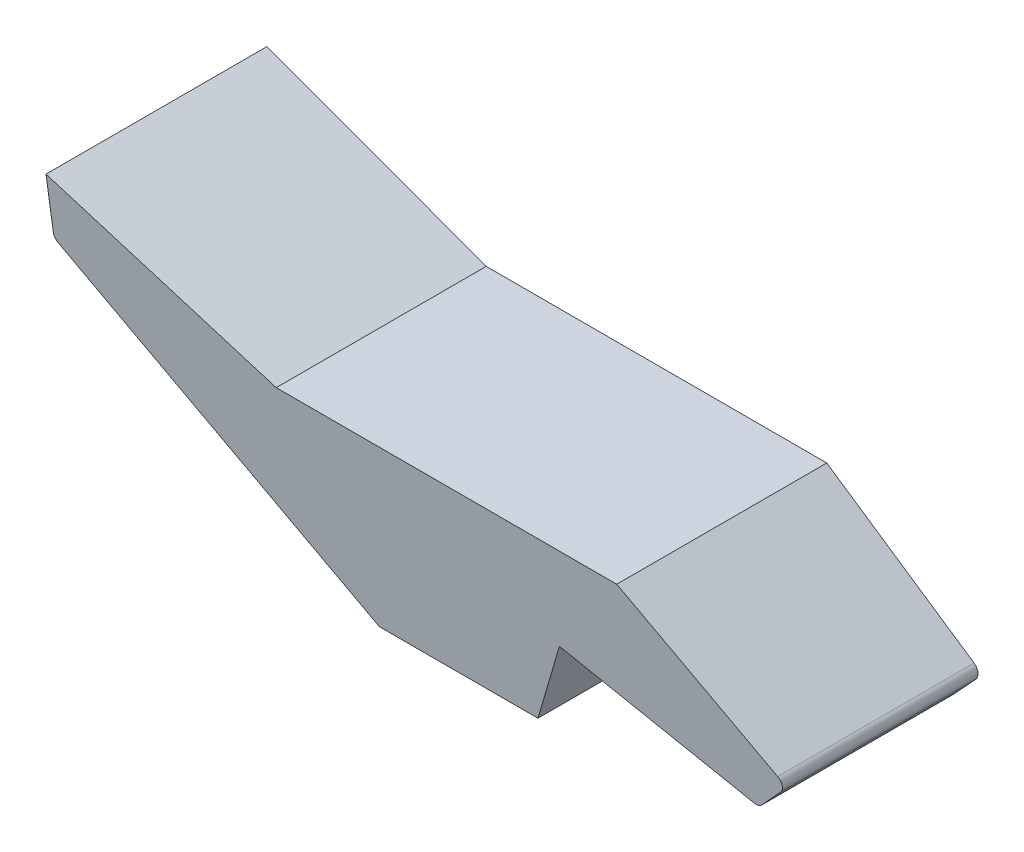
ISO-10303-21;
HEADER;
FILE_DESCRIPTION(('STEP AP214'),'2;1');
FILE_NAME('part.step','',(''),(''),'','','');
FILE_SCHEMA(('AUTOMOTIVE_DESIGN { 1 0 10303 214 1 1 1 1 }'));
ENDSEC;
DATA;
#1=APPLICATION_CONTEXT('core data for automotive mechanical design processes');
#2=APPLICATION_PROTOCOL_DEFINITION('international standard','automotive_design',2000,#1);
#3=PRODUCT_CONTEXT('',#1,'mechanical');
#4=PRODUCT('Part','Part','',(#3));
#5=PRODUCT_RELATED_PRODUCT_CATEGORY('part','',(#4));
#6=PRODUCT_DEFINITION_FORMATION('','',#4);
#7=PRODUCT_DEFINITION_CONTEXT('part definition',#1,'design');
#8=PRODUCT_DEFINITION('design','',#6,#7);
#9=PRODUCT_DEFINITION_SHAPE('','',#8);
#10=(LENGTH_UNIT() NAMED_UNIT(*) SI_UNIT(.MILLI.,.METRE.));
#11=(NAMED_UNIT(*) PLANE_ANGLE_UNIT() SI_UNIT($,.RADIAN.));
#12=(NAMED_UNIT(*) SI_UNIT($,.STERADIAN.) SOLID_ANGLE_UNIT());
#13=UNCERTAINTY_MEASURE_WITH_UNIT(LENGTH_MEASURE(1.E-05),#10,'distance_accuracy_value','');
#14=(GEOMETRIC_REPRESENTATION_CONTEXT(3) GLOBAL_UNCERTAINTY_ASSIGNED_CONTEXT((#13)) GLOBAL_UNIT_ASSIGNED_CONTEXT((#10,
#11,#12)) REPRESENTATION_CONTEXT('',''));
#15=CARTESIAN_POINT('',(0.,0.,0.));
#16=DIRECTION('',(0.,0.,1.));
#17=DIRECTION('',(1.,0.,0.));
#18=AXIS2_PLACEMENT_3D('',#15,#16,#17);
#19=CARTESIAN_POINT('',(483.178024687114,139.321516659427,-19.05));
#20=DIRECTION('',(0.,0.,1.));
#21=DIRECTION('',(1.,0.,0.));
#22=AXIS2_PLACEMENT_3D('',#19,#20,#21);
#23=CYLINDRICAL_SURFACE('',#22,1.58750000000002);
#24=DIRECTION('',(0.,0.,1.));
#25=VECTOR('',#24,1.);
#26=CARTESIAN_POINT('',(484.067254744056,140.63659314231,-19.05));
#27=LINE('',#26,#25);
#28=CARTESIAN_POINT('',(484.067254744056,140.63659314231,-19.05));
#29=VERTEX_POINT('',#28);
#30=CARTESIAN_POINT('',(484.067254744056,140.63659314231,16.242353679102));
#31=VERTEX_POINT('',#30);
#32=EDGE_CURVE('E36',#29,#31,#27,.T.);
#33=ORIENTED_EDGE('',*,*,#32,.T.);
#34=CARTESIAN_POINT('',(483.178024687114,139.321516659427,16.0639513593106));
#35=DIRECTION('',(0.,-0.134427944288445,0.990923371302939));
#36=DIRECTION('',(0.,0.990923371302939,0.134427944288445));
#37=AXIS2_PLACEMENT_3D('',#34,#35,#36);
#38=ELLIPSE('',#37,1.60204113251729,1.58750000000002);
#39=CARTESIAN_POINT('',(484.344651114715,138.244883468213,15.917896083152));
#40=VERTEX_POINT('',#39);
#41=EDGE_CURVE('E49',#31,#40,#38,.F.);
#42=ORIENTED_EDGE('',*,*,#41,.T.);
#43=DIRECTION('',(0.,0.,1.));
#44=VECTOR('',#43,1.);
#45=CARTESIAN_POINT('',(484.344651114715,138.244883468213,-19.05));
#46=LINE('',#45,#44);
#47=CARTESIAN_POINT('',(484.344651114715,138.244883468213,-19.05));
#48=VERTEX_POINT('',#47);
#49=EDGE_CURVE('E11',#48,#40,#46,.T.);
#50=ORIENTED_EDGE('',*,*,#49,.F.);
#51=CARTESIAN_POINT('',(483.178024687114,139.321516659427,-19.05));
#52=DIRECTION('',(0.,0.,1.));
#53=DIRECTION('',(1.,0.,0.));
#54=AXIS2_PLACEMENT_3D('',#51,#52,#53);
#55=CIRCLE('',#54,1.58750000000002);
#56=EDGE_CURVE('E234',#48,#29,#55,.T.);
#57=ORIENTED_EDGE('',*,*,#56,.T.);
#58=EDGE_LOOP('',(#33,#42,#50,#57));
#59=FACE_BOUND('',#58,.T.);
#60=ADVANCED_FACE('F33',(#59),#23,.T.);
#61=CARTESIAN_POINT('',(480.349350512616,133.915625085084,-19.05));
#62=DIRECTION('',(0.734882789039786,-0.678194136197819,0.));
#63=DIRECTION('',(0.678194136197819,0.734882789039786,0.));
#64=AXIS2_PLACEMENT_3D('',#61,#62,#63);
#65=PLANE('',#64);
#66=ORIENTED_EDGE('',*,*,#49,.T.);
#67=DIRECTION('',(-0.67484882495606,-0.731257851098959,-0.0992019085580403));
#68=VECTOR('',#67,1.);
#69=CARTESIAN_POINT('',(478.04769737874,131.421582178863,14.9922519898233));
#70=LINE('',#69,#68);
#71=CARTESIAN_POINT('',(480.349350512616,133.915625085084,15.3305920376613));
#72=VERTEX_POINT('',#71);
#73=EDGE_CURVE('E230',#40,#72,#70,.T.);
#74=ORIENTED_EDGE('',*,*,#73,.T.);
#75=DIRECTION('',(0.,0.,1.));
#76=VECTOR('',#75,1.);
#77=CARTESIAN_POINT('',(480.349350512616,133.915625085084,-19.05));
#78=LINE('',#77,#76);
#79=CARTESIAN_POINT('',(480.349350512616,133.915625085084,-19.05));
#80=VERTEX_POINT('',#79);
#81=EDGE_CURVE('E41',#80,#72,#78,.T.);
#82=ORIENTED_EDGE('',*,*,#81,.F.);
#83=DIRECTION('',(0.678194136197819,0.734882789039786,0.));
#84=VECTOR('',#83,1.);
#85=CARTESIAN_POINT('',(480.349350512616,133.915625085084,-19.05));
#86=LINE('',#85,#84);
#87=EDGE_CURVE('E155',#80,#48,#86,.T.);
#88=ORIENTED_EDGE('',*,*,#87,.T.);
#89=EDGE_LOOP('',(#66,#74,#82,#88));
#90=FACE_BOUND('',#89,.T.);
#91=ADVANCED_FACE('F250',(#90),#65,.T.);
#92=CARTESIAN_POINT('',(479.182724085015,134.992258276298,-19.05));
#93=DIRECTION('',(0.,0.,1.));
#94=DIRECTION('',(1.,0.,0.));
#95=AXIS2_PLACEMENT_3D('',#92,#93,#94);
#96=CYLINDRICAL_SURFACE('',#95,1.5875);
#97=ORIENTED_EDGE('',*,*,#81,.T.);
#98=CARTESIAN_POINT('',(479.182724085015,134.992258276298,15.4766473138199));
#99=DIRECTION('',(0.,-0.134427944288445,0.990923371302939));
#100=DIRECTION('',(0.,0.990923371302939,0.134427944288445));
#101=AXIS2_PLACEMENT_3D('',#98,#99,#100);
#102=ELLIPSE('',#101,1.60204113251727,1.5875);
#103=CARTESIAN_POINT('',(478.819933038146,133.446768416638,15.2669872828131));
#104=VERTEX_POINT('',#103);
#105=EDGE_CURVE('E227',#72,#104,#102,.F.);
#106=ORIENTED_EDGE('',*,*,#105,.T.);
#107=DIRECTION('',(0.,0.,1.));
#108=VECTOR('',#107,1.);
#109=CARTESIAN_POINT('',(478.819933038146,133.446768416638,-19.05));
#110=LINE('',#109,#108);
#111=CARTESIAN_POINT('',(478.819933038146,133.446768416638,-19.05));
#112=VERTEX_POINT('',#111);
#113=EDGE_CURVE('E168',#112,#104,#110,.T.);
#114=ORIENTED_EDGE('',*,*,#113,.F.);
#115=CARTESIAN_POINT('',(479.182724085015,134.992258276298,-19.05));
#116=DIRECTION('',(0.,0.,1.));
#117=DIRECTION('',(1.,0.,0.));
#118=AXIS2_PLACEMENT_3D('',#115,#116,#117);
#119=CIRCLE('',#118,1.5875);
#120=EDGE_CURVE('E157',#112,#80,#119,.T.);
#121=ORIENTED_EDGE('',*,*,#120,.T.);
#122=EDGE_LOOP('',(#97,#106,#114,#121));
#123=FACE_BOUND('',#122,.T.);
#124=ADVANCED_FACE('F254',(#123),#96,.T.);
#125=CARTESIAN_POINT('',(444.978063493661,141.390869248677,-19.05));
#126=DIRECTION('',(-0.228529793303027,-0.973536919470893,0.));
#127=DIRECTION('',(0.973536919470893,-0.228529793303027,0.));
#128=AXIS2_PLACEMENT_3D('',#125,#126,#127);
#129=PLANE('',#128);
#130=ORIENTED_EDGE('',*,*,#113,.T.);
#131=DIRECTION('',(-0.973069405997484,0.228420048356217,0.0309872977306197));
#132=VECTOR('',#131,1.);
#133=CARTESIAN_POINT('',(446.045311842789,141.140341467192,16.310691810701));
#134=LINE('',#133,#132);
#135=CARTESIAN_POINT('',(444.978063493661,141.390869248677,16.3446782274387));
#136=VERTEX_POINT('',#135);
#137=EDGE_CURVE('E221',#104,#136,#134,.T.);
#138=ORIENTED_EDGE('',*,*,#137,.T.);
#139=DIRECTION('',(0.,0.,1.));
#140=VECTOR('',#139,1.);
#141=CARTESIAN_POINT('',(444.978063493661,141.390869248677,-19.05));
#142=LINE('',#141,#140);
#143=CARTESIAN_POINT('',(444.978063493661,141.390869248677,-19.05));
#144=VERTEX_POINT('',#143);
#145=EDGE_CURVE('E171',#144,#136,#142,.T.);
#146=ORIENTED_EDGE('',*,*,#145,.F.);
#147=DIRECTION('',(0.973536919470893,-0.228529793303027,0.));
#148=VECTOR('',#147,1.);
#149=CARTESIAN_POINT('',(444.978063493661,141.390869248677,-19.05));
#150=LINE('',#149,#148);
#151=EDGE_CURVE('E162',#144,#112,#150,.T.);
#152=ORIENTED_EDGE('',*,*,#151,.T.);
#153=EDGE_LOOP('',(#130,#138,#146,#152));
#154=FACE_BOUND('',#153,.T.);
#155=ADVANCED_FACE('F209',(#154),#129,.T.);
#156=CARTESIAN_POINT('',(439.063985597395,126.226566950559,-19.05));
#157=DIRECTION('',(0.931654555106779,-0.363345276491644,0.));
#158=DIRECTION('',(0.363345276491644,0.931654555106779,0.));
#159=AXIS2_PLACEMENT_3D('',#156,#157,#158);
#160=PLANE('',#159);
#161=ORIENTED_EDGE('',*,*,#145,.T.);
#162=DIRECTION('',(-0.360477581078531,-0.924301489944949,-0.125390068288198));
#163=VECTOR('',#162,1.);
#164=CARTESIAN_POINT('',(437.557120312516,122.362809809844,13.7633455147009));
#165=LINE('',#164,#163);
#166=CARTESIAN_POINT('',(439.063985597395,126.226566950559,14.2875));
#167=VERTEX_POINT('',#166);
#168=EDGE_CURVE('E215',#136,#167,#165,.T.);
#169=ORIENTED_EDGE('',*,*,#168,.T.);
#170=DIRECTION('',(0.,0.,1.));
#171=VECTOR('',#170,1.);
#172=CARTESIAN_POINT('',(439.063985597395,126.226566950559,-19.05));
#173=LINE('',#172,#171);
#174=CARTESIAN_POINT('',(439.063985597395,126.226566950559,-19.05));
#175=VERTEX_POINT('',#174);
#176=EDGE_CURVE('E174',#175,#167,#173,.T.);
#177=ORIENTED_EDGE('',*,*,#176,.F.);
#178=DIRECTION('',(0.363345276491644,0.931654555106779,0.));
#179=VECTOR('',#178,1.);
#180=CARTESIAN_POINT('',(439.063985597395,126.226566950559,-19.05));
#181=LINE('',#180,#179);
#182=EDGE_CURVE('E199',#175,#144,#181,.T.);
#183=ORIENTED_EDGE('',*,*,#182,.T.);
#184=EDGE_LOOP('',(#161,#169,#177,#183));
#185=FACE_BOUND('',#184,.T.);
#186=ADVANCED_FACE('F213',(#185),#160,.T.);
#187=CARTESIAN_POINT('',(410.584136752497,126.226566950559,-19.05));
#188=DIRECTION('',(0.,-1.,0.));
#189=DIRECTION('',(0.,0.,-1.));
#190=AXIS2_PLACEMENT_3D('',#187,#188,#189);
#191=PLANE('',#190);
#192=ORIENTED_EDGE('',*,*,#176,.T.);
#193=DIRECTION('',(-1.,0.,0.));
#194=VECTOR('',#193,1.);
#195=CARTESIAN_POINT('',(410.584136752497,126.226566950559,14.2875));
#196=LINE('',#195,#194);
#197=CARTESIAN_POINT('',(410.584136752497,126.226566950559,14.2875));
#198=VERTEX_POINT('',#197);
#199=EDGE_CURVE('E219',#167,#198,#196,.T.);
#200=ORIENTED_EDGE('',*,*,#199,.T.);
#201=DIRECTION('',(0.,0.,1.));
#202=VECTOR('',#201,1.);
#203=CARTESIAN_POINT('',(410.584136752497,126.226566950559,-19.05));
#204=LINE('',#203,#202);
#205=CARTESIAN_POINT('',(410.584136752497,126.226566950559,-19.05));
#206=VERTEX_POINT('',#205);
#207=EDGE_CURVE('E177',#206,#198,#204,.T.);
#208=ORIENTED_EDGE('',*,*,#207,.F.);
#209=DIRECTION('',(1.,0.,0.));
#210=VECTOR('',#209,1.);
#211=CARTESIAN_POINT('',(410.584136752497,126.226566950559,-19.05));
#212=LINE('',#211,#210);
#213=EDGE_CURVE('E197',#206,#175,#212,.T.);
#214=ORIENTED_EDGE('',*,*,#213,.T.);
#215=EDGE_LOOP('',(#192,#200,#208,#214));
#216=FACE_BOUND('',#215,.T.);
#217=ADVANCED_FACE('F218',(#216),#191,.T.);
#218=CARTESIAN_POINT('',(357.757805579967,161.946741471206,-19.05));
#219=DIRECTION('',(-0.560144917758574,-0.828394634886803,0.));
#220=DIRECTION('',(0.828394634886803,-0.560144917758574,0.));
#221=AXIS2_PLACEMENT_3D('',#218,#219,#220);
#222=PLANE('',#221);
#223=ORIENTED_EDGE('',*,*,#207,.T.);
#224=DIRECTION('',(-0.826013241183595,0.55853466399321,0.0757704065408414));
#225=VECTOR('',#224,1.);
#226=CARTESIAN_POINT('',(360.147595793035,160.330810143328,18.9140568425227));
#227=LINE('',#226,#225);
#228=CARTESIAN_POINT('',(357.757805579967,161.946741471206,19.1332729119067));
#229=VERTEX_POINT('',#228);
#230=EDGE_CURVE('E191',#198,#229,#227,.T.);
#231=ORIENTED_EDGE('',*,*,#230,.T.);
#232=DIRECTION('',(0.,0.,1.));
#233=VECTOR('',#232,1.);
#234=CARTESIAN_POINT('',(357.757805579967,161.946741471206,-19.05));
#235=LINE('',#234,#233);
#236=CARTESIAN_POINT('',(357.757805579967,161.946741471206,-19.05));
#237=VERTEX_POINT('',#236);
#238=EDGE_CURVE('E146',#237,#229,#235,.T.);
#239=ORIENTED_EDGE('',*,*,#238,.F.);
#240=DIRECTION('',(0.828394634886803,-0.560144917758574,0.));
#241=VECTOR('',#240,1.);
#242=CARTESIAN_POINT('',(357.757805579967,161.946741471206,-19.05));
#243=LINE('',#242,#241);
#244=EDGE_CURVE('E190',#237,#206,#243,.T.);
#245=ORIENTED_EDGE('',*,*,#244,.T.);
#246=EDGE_LOOP('',(#223,#231,#239,#245));
#247=FACE_BOUND('',#246,.T.);
#248=ADVANCED_FACE('F189',(#247),#222,.T.);
#249=CARTESIAN_POINT('',(358.647035636908,163.261817954089,-19.05));
#250=DIRECTION('',(0.,0.,1.));
#251=DIRECTION('',(1.,0.,0.));
#252=AXIS2_PLACEMENT_3D('',#249,#250,#251);
#253=CYLINDRICAL_SURFACE('',#252,1.58749999999998);
#254=ORIENTED_EDGE('',*,*,#238,.T.);
#255=CARTESIAN_POINT('',(358.647035636908,163.261817954089,19.3116752316982));
#256=DIRECTION('',(0.,-0.134427944288445,0.990923371302939));
#257=DIRECTION('',(0.,0.990923371302939,0.134427944288445));
#258=AXIS2_PLACEMENT_3D('',#255,#256,#257);
#259=ELLIPSE('',#258,1.60204113251726,1.58749999999998);
#260=CARTESIAN_POINT('',(357.059535636908,163.261817954089,19.3116752316982));
#261=VERTEX_POINT('',#260);
#262=EDGE_CURVE('E138',#229,#261,#259,.F.);
#263=ORIENTED_EDGE('',*,*,#262,.T.);
#264=DIRECTION('',(0.,0.,1.));
#265=VECTOR('',#264,1.);
#266=CARTESIAN_POINT('',(357.059535636908,163.261817954089,-19.05));
#267=LINE('',#266,#265);
#268=CARTESIAN_POINT('',(357.059535636908,163.261817954089,-19.05));
#269=VERTEX_POINT('',#268);
#270=EDGE_CURVE('E137',#269,#261,#267,.T.);
#271=ORIENTED_EDGE('',*,*,#270,.F.);
#272=CARTESIAN_POINT('',(358.647035636908,163.261817954089,-19.05));
#273=DIRECTION('',(0.,0.,1.));
#274=DIRECTION('',(1.,0.,0.));
#275=AXIS2_PLACEMENT_3D('',#272,#273,#274);
#276=CIRCLE('',#275,1.58749999999998);
#277=EDGE_CURVE('E184',#269,#237,#276,.T.);
#278=ORIENTED_EDGE('',*,*,#277,.T.);
#279=EDGE_LOOP('',(#254,#263,#271,#278));
#280=FACE_BOUND('',#279,.T.);
#281=ADVANCED_FACE('F182',(#280),#253,.T.);
#282=CARTESIAN_POINT('',(357.059535636908,173.035014711033,-19.05));
#283=DIRECTION('',(-1.,0.,0.));
#284=DIRECTION('',(0.,0.,1.));
#285=AXIS2_PLACEMENT_3D('',#282,#283,#284);
#286=PLANE('',#285);
#287=ORIENTED_EDGE('',*,*,#270,.T.);
#288=DIRECTION('',(0.,0.990923371302939,0.134427944288445));
#289=VECTOR('',#288,1.);
#290=CARTESIAN_POINT('',(357.059535636908,167.74833047589,19.9203122593396));
#291=LINE('',#290,#289);
#292=CARTESIAN_POINT('',(357.059535636908,173.035014711033,20.6375));
#293=VERTEX_POINT('',#292);
#294=EDGE_CURVE('E123',#261,#293,#291,.T.);
#295=ORIENTED_EDGE('',*,*,#294,.T.);
#296=DIRECTION('',(0.,0.,1.));
#297=VECTOR('',#296,1.);
#298=CARTESIAN_POINT('',(357.059535636908,173.035014711033,-19.05));
#299=LINE('',#298,#297);
#300=CARTESIAN_POINT('',(357.059535636908,173.035014711033,-19.05));
#301=VERTEX_POINT('',#300);
#302=EDGE_CURVE('E135',#301,#293,#299,.T.);
#303=ORIENTED_EDGE('',*,*,#302,.F.);
#304=DIRECTION('',(0.,-1.,0.));
#305=VECTOR('',#304,1.);
#306=CARTESIAN_POINT('',(357.059535636908,173.035014711033,-19.05));
#307=LINE('',#306,#305);
#308=EDGE_CURVE('E201',#301,#269,#307,.T.);
#309=ORIENTED_EDGE('',*,*,#308,.T.);
#310=EDGE_LOOP('',(#287,#295,#303,#309));
#311=FACE_BOUND('',#310,.T.);
#312=ADVANCED_FACE('F133',(#311),#286,.T.);
#313=CARTESIAN_POINT('',(396.440312315708,158.530595004281,-19.05));
#314=DIRECTION('',(0.345615403489857,0.938376253360316,0.));
#315=DIRECTION('',(-0.938376253360316,0.345615403489857,0.));
#316=AXIS2_PLACEMENT_3D('',#313,#314,#315);
#317=PLANE('',#316);
#318=ORIENTED_EDGE('',*,*,#302,.T.);
#319=DIRECTION('',(0.937346538794442,-0.345236147073372,-0.0468344847736453));
#320=VECTOR('',#319,1.);
#321=CARTESIAN_POINT('',(398.096218697799,157.920704514898,18.587103664779));
#322=LINE('',#321,#320);
#323=CARTESIAN_POINT('',(396.440312315708,158.530595004281,18.6698409652638));
#324=VERTEX_POINT('',#323);
#325=EDGE_CURVE('E120',#293,#324,#322,.T.);
#326=ORIENTED_EDGE('',*,*,#325,.T.);
#327=DIRECTION('',(0.,0.,1.));
#328=VECTOR('',#327,1.);
#329=CARTESIAN_POINT('',(396.440312315708,158.530595004281,-19.05));
#330=LINE('',#329,#328);
#331=CARTESIAN_POINT('',(396.440312315708,158.530595004281,-19.05));
#332=VERTEX_POINT('',#331);
#333=EDGE_CURVE('E144',#332,#324,#330,.T.);
#334=ORIENTED_EDGE('',*,*,#333,.F.);
#335=DIRECTION('',(-0.938376253360316,0.345615403489856,0.));
#336=VECTOR('',#335,1.);
#337=CARTESIAN_POINT('',(396.440312315708,158.530595004281,-19.05));
#338=LINE('',#337,#336);
#339=EDGE_CURVE('E143',#332,#301,#338,.T.);
#340=ORIENTED_EDGE('',*,*,#339,.T.);
#341=EDGE_LOOP('',(#318,#326,#334,#340));
#342=FACE_BOUND('',#341,.T.);
#343=ADVANCED_FACE('F141',(#342),#317,.T.);
#344=CARTESIAN_POINT('',(457.603933076464,158.530595004281,-19.05));
#345=DIRECTION('',(0.,1.,0.));
#346=DIRECTION('',(0.,0.,1.));
#347=AXIS2_PLACEMENT_3D('',#344,#345,#346);
#348=PLANE('',#347);
#349=ORIENTED_EDGE('',*,*,#333,.T.);
#350=DIRECTION('',(1.,0.,0.));
#351=VECTOR('',#350,1.);
#352=CARTESIAN_POINT('',(457.603933076464,158.530595004281,18.6698409652638));
#353=LINE('',#352,#351);
#354=CARTESIAN_POINT('',(457.603933076464,158.530595004281,18.6698409652638));
#355=VERTEX_POINT('',#354);
#356=EDGE_CURVE('E126',#324,#355,#353,.T.);
#357=ORIENTED_EDGE('',*,*,#356,.T.);
#358=DIRECTION('',(0.,0.,1.));
#359=VECTOR('',#358,1.);
#360=CARTESIAN_POINT('',(457.603933076464,158.530595004281,-19.05));
#361=LINE('',#360,#359);
#362=CARTESIAN_POINT('',(457.603933076464,158.530595004281,-19.05));
#363=VERTEX_POINT('',#362);
#364=EDGE_CURVE('E148',#363,#355,#361,.T.);
#365=ORIENTED_EDGE('',*,*,#364,.F.);
#366=DIRECTION('',(-1.,0.,0.));
#367=VECTOR('',#366,1.);
#368=CARTESIAN_POINT('',(457.603933076464,158.530595004281,-19.05));
#369=LINE('',#368,#367);
#370=EDGE_CURVE('E238',#363,#332,#369,.T.);
#371=ORIENTED_EDGE('',*,*,#370,.T.);
#372=EDGE_LOOP('',(#349,#357,#365,#371));
#373=FACE_BOUND('',#372,.T.);
#374=ADVANCED_FACE('F244',(#373),#348,.T.);
#375=CARTESIAN_POINT('',(484.067254744056,140.63659314231,-19.05));
#376=DIRECTION('',(0.560144917758573,0.828394634886804,0.));
#377=DIRECTION('',(-0.828394634886804,0.560144917758573,0.));
#378=AXIS2_PLACEMENT_3D('',#375,#376,#377);
#379=PLANE('',#378);
#380=ORIENTED_EDGE('',*,*,#364,.T.);
#381=DIRECTION('',(0.826013241183596,-0.558534663993209,-0.0757704065408412));
#382=VECTOR('',#381,1.);
#383=CARTESIAN_POINT('',(486.276109956993,139.143006668563,16.0397348237018));
#384=LINE('',#383,#382);
#385=EDGE_CURVE('E245',#355,#31,#384,.T.);
#386=ORIENTED_EDGE('',*,*,#385,.T.);
#387=ORIENTED_EDGE('',*,*,#32,.F.);
#388=DIRECTION('',(-0.828394634886804,0.560144917758573,0.));
#389=VECTOR('',#388,1.);
#390=CARTESIAN_POINT('',(484.067254744056,140.63659314231,-19.05));
#391=LINE('',#390,#389);
#392=EDGE_CURVE('E236',#29,#363,#391,.T.);
#393=ORIENTED_EDGE('',*,*,#392,.T.);
#394=EDGE_LOOP('',(#380,#386,#387,#393));
#395=FACE_BOUND('',#394,.T.);
#396=ADVANCED_FACE('F248',(#395),#379,.T.);
#397=CARTESIAN_POINT('',(483.178024687114,139.321516659427,-19.05));
#398=DIRECTION('',(0.,0.,1.));
#399=DIRECTION('',(1.,0.,0.));
#400=AXIS2_PLACEMENT_3D('',#397,#398,#399);
#401=PLANE('',#400);
#402=ORIENTED_EDGE('',*,*,#56,.F.);
#403=ORIENTED_EDGE('',*,*,#87,.F.);
#404=ORIENTED_EDGE('',*,*,#120,.F.);
#405=ORIENTED_EDGE('',*,*,#151,.F.);
#406=ORIENTED_EDGE('',*,*,#182,.F.);
#407=ORIENTED_EDGE('',*,*,#213,.F.);
#408=ORIENTED_EDGE('',*,*,#244,.F.);
#409=ORIENTED_EDGE('',*,*,#277,.F.);
#410=ORIENTED_EDGE('',*,*,#308,.F.);
#411=ORIENTED_EDGE('',*,*,#339,.F.);
#412=ORIENTED_EDGE('',*,*,#370,.F.);
#413=ORIENTED_EDGE('',*,*,#392,.F.);
#414=EDGE_LOOP('',(#402,#403,#404,#405,#406,#407,#408,#409,#410,#411,#412,#413));
#415=FACE_BOUND('',#414,.T.);
#416=ADVANCED_FACE('F194',(#415),#401,.F.);
#417=CARTESIAN_POINT('',(0.,0.377817835665941,-2.78504983051098));
#418=DIRECTION('',(0.,-0.134427944288445,0.990923371302939));
#419=DIRECTION('',(0.,-0.990923371302939,-0.134427944288445));
#420=AXIS2_PLACEMENT_3D('',#417,#418,#419);
#421=PLANE('',#420);
#422=ORIENTED_EDGE('',*,*,#385,.F.);
#423=ORIENTED_EDGE('',*,*,#356,.F.);
#424=ORIENTED_EDGE('',*,*,#325,.F.);
#425=ORIENTED_EDGE('',*,*,#294,.F.);
#426=ORIENTED_EDGE('',*,*,#262,.F.);
#427=ORIENTED_EDGE('',*,*,#230,.F.);
#428=ORIENTED_EDGE('',*,*,#199,.F.);
#429=ORIENTED_EDGE('',*,*,#168,.F.);
#430=ORIENTED_EDGE('',*,*,#137,.F.);
#431=ORIENTED_EDGE('',*,*,#105,.F.);
#432=ORIENTED_EDGE('',*,*,#73,.F.);
#433=ORIENTED_EDGE('',*,*,#41,.F.);
#434=EDGE_LOOP('',(#422,#423,#424,#425,#426,#427,#428,#429,#430,#431,#432,#433));
#435=FACE_BOUND('',#434,.T.);
#436=ADVANCED_FACE('F122',(#435),#421,.T.);
#437=CLOSED_SHELL('',(#60,#91,#124,#155,#186,#217,#248,#281,#312,#343,#374,#396,#416,#436));
#438=MANIFOLD_SOLID_BREP('B2',#437);
#439=ADVANCED_BREP_SHAPE_REPRESENTATION('',(#18,#438),#14);
#440=SHAPE_DEFINITION_REPRESENTATION(#9,#439);
ENDSEC;
END-ISO-10303-21;
